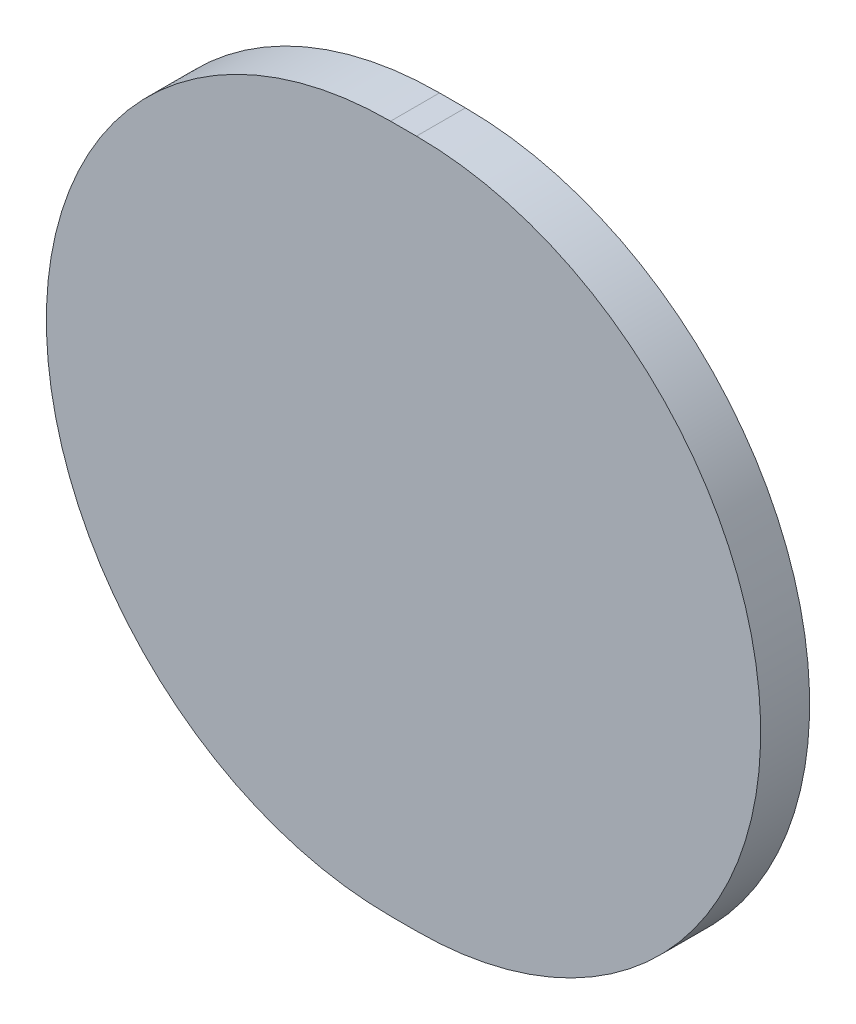
ISO-10303-21;
HEADER;
FILE_DESCRIPTION(('STEP AP214'),'2;1');
FILE_NAME('part.step','',(''),(''),'','','');
FILE_SCHEMA(('AUTOMOTIVE_DESIGN { 1 0 10303 214 1 1 1 1 }'));
ENDSEC;
DATA;
#1=APPLICATION_CONTEXT('core data for automotive mechanical design processes');
#2=APPLICATION_PROTOCOL_DEFINITION('international standard','automotive_design',2000,#1);
#3=PRODUCT_CONTEXT('',#1,'mechanical');
#4=PRODUCT('Part','Part','',(#3));
#5=PRODUCT_RELATED_PRODUCT_CATEGORY('part','',(#4));
#6=PRODUCT_DEFINITION_FORMATION('','',#4);
#7=PRODUCT_DEFINITION_CONTEXT('part definition',#1,'design');
#8=PRODUCT_DEFINITION('design','',#6,#7);
#9=PRODUCT_DEFINITION_SHAPE('','',#8);
#10=(LENGTH_UNIT() NAMED_UNIT(*) SI_UNIT(.MILLI.,.METRE.));
#11=(NAMED_UNIT(*) PLANE_ANGLE_UNIT() SI_UNIT($,.RADIAN.));
#12=(NAMED_UNIT(*) SI_UNIT($,.STERADIAN.) SOLID_ANGLE_UNIT());
#13=UNCERTAINTY_MEASURE_WITH_UNIT(LENGTH_MEASURE(1.E-05),#10,'distance_accuracy_value','');
#14=(GEOMETRIC_REPRESENTATION_CONTEXT(3) GLOBAL_UNCERTAINTY_ASSIGNED_CONTEXT((#13)) GLOBAL_UNIT_ASSIGNED_CONTEXT((#10,
#11,#12)) REPRESENTATION_CONTEXT('',''));
#15=CARTESIAN_POINT('',(0.,0.,0.));
#16=DIRECTION('',(0.,0.,1.));
#17=DIRECTION('',(1.,0.,0.));
#18=AXIS2_PLACEMENT_3D('',#15,#16,#17);
#19=CARTESIAN_POINT('',(79.44205092,67.34064764,0.));
#20=DIRECTION('',(0.,1.,0.));
#21=DIRECTION('',(1.,0.,0.));
#22=AXIS2_PLACEMENT_3D('',#19,#20,#21);
#23=PLANE('',#22);
#24=DIRECTION('',(1.,0.,0.));
#25=VECTOR('',#24,1.);
#26=CARTESIAN_POINT('',(79.44205092,67.34064764,0.03556));
#27=LINE('',#26,#25);
#28=CARTESIAN_POINT('',(79.44205092,67.34064764,0.03556));
#29=VERTEX_POINT('',#28);
#30=CARTESIAN_POINT('',(79.4608647,67.34064764,0.03556));
#31=VERTEX_POINT('',#30);
#32=EDGE_CURVE('E11',#29,#31,#27,.T.);
#33=ORIENTED_EDGE('',*,*,#32,.F.);
#34=DIRECTION('',(0.,0.,1.));
#35=VECTOR('',#34,1.);
#36=CARTESIAN_POINT('',(79.44205092,67.34064764,0.));
#37=LINE('',#36,#35);
#38=CARTESIAN_POINT('',(79.44205092,67.34064764,0.));
#39=VERTEX_POINT('',#38);
#40=EDGE_CURVE('E24',#39,#29,#37,.T.);
#41=ORIENTED_EDGE('',*,*,#40,.F.);
#42=DIRECTION('',(1.,0.,0.));
#43=VECTOR('',#42,1.);
#44=CARTESIAN_POINT('',(79.44205092,67.34064764,0.));
#45=LINE('',#44,#43);
#46=CARTESIAN_POINT('',(79.4608647,67.34064764,0.));
#47=VERTEX_POINT('',#46);
#48=EDGE_CURVE('E75',#39,#47,#45,.T.);
#49=ORIENTED_EDGE('',*,*,#48,.T.);
#50=DIRECTION('',(0.,0.,1.));
#51=VECTOR('',#50,1.);
#52=CARTESIAN_POINT('',(79.4608647,67.34064764,0.));
#53=LINE('',#52,#51);
#54=EDGE_CURVE('E37',#47,#31,#53,.T.);
#55=ORIENTED_EDGE('',*,*,#54,.T.);
#56=EDGE_LOOP('',(#33,#41,#49,#55));
#57=FACE_BOUND('',#56,.T.);
#58=ADVANCED_FACE('F17',(#57),#23,.F.);
#59=CARTESIAN_POINT('',(79.4608647,67.59064714,0.));
#60=DIRECTION('',(0.,0.,-1.));
#61=DIRECTION('',(0.,-1.,0.));
#62=AXIS2_PLACEMENT_3D('',#59,#60,#61);
#63=CYLINDRICAL_SURFACE('',#62,0.249999500000001);
#64=CARTESIAN_POINT('',(79.4608647,67.59064714,0.03556));
#65=DIRECTION('',(0.,0.,1.));
#66=DIRECTION('',(0.,-1.,0.));
#67=AXIS2_PLACEMENT_3D('',#64,#65,#66);
#68=CIRCLE('',#67,0.249999500000001);
#69=CARTESIAN_POINT('',(79.4608647,67.84064664,0.03556));
#70=VERTEX_POINT('',#69);
#71=EDGE_CURVE('E83',#31,#70,#68,.T.);
#72=ORIENTED_EDGE('',*,*,#71,.F.);
#73=ORIENTED_EDGE('',*,*,#54,.F.);
#74=CARTESIAN_POINT('',(79.4608647,67.59064714,0.));
#75=DIRECTION('',(0.,0.,1.));
#76=DIRECTION('',(0.,-1.,0.));
#77=AXIS2_PLACEMENT_3D('',#74,#75,#76);
#78=CIRCLE('',#77,0.249999500000001);
#79=CARTESIAN_POINT('',(79.4608647,67.84064664,0.));
#80=VERTEX_POINT('',#79);
#81=EDGE_CURVE('E81',#47,#80,#78,.T.);
#82=ORIENTED_EDGE('',*,*,#81,.T.);
#83=DIRECTION('',(0.,0.,1.));
#84=VECTOR('',#83,1.);
#85=CARTESIAN_POINT('',(79.4608647,67.84064664,0.));
#86=LINE('',#85,#84);
#87=EDGE_CURVE('E67',#80,#70,#86,.T.);
#88=ORIENTED_EDGE('',*,*,#87,.T.);
#89=EDGE_LOOP('',(#72,#73,#82,#88));
#90=FACE_BOUND('',#89,.T.);
#91=ADVANCED_FACE('F89',(#90),#63,.T.);
#92=CARTESIAN_POINT('',(79.4608647,67.84064664,0.));
#93=DIRECTION('',(0.,-1.,0.));
#94=DIRECTION('',(-1.,0.,0.));
#95=AXIS2_PLACEMENT_3D('',#92,#93,#94);
#96=PLANE('',#95);
#97=DIRECTION('',(-1.,0.,0.));
#98=VECTOR('',#97,1.);
#99=CARTESIAN_POINT('',(79.4608647,67.84064664,0.03556));
#100=LINE('',#99,#98);
#101=CARTESIAN_POINT('',(79.44205092,67.84064664,0.03556));
#102=VERTEX_POINT('',#101);
#103=EDGE_CURVE('E71',#70,#102,#100,.T.);
#104=ORIENTED_EDGE('',*,*,#103,.F.);
#105=ORIENTED_EDGE('',*,*,#87,.F.);
#106=DIRECTION('',(-1.,0.,0.));
#107=VECTOR('',#106,1.);
#108=CARTESIAN_POINT('',(79.4608647,67.84064664,0.));
#109=LINE('',#108,#107);
#110=CARTESIAN_POINT('',(79.44205092,67.84064664,0.));
#111=VERTEX_POINT('',#110);
#112=EDGE_CURVE('E63',#80,#111,#109,.T.);
#113=ORIENTED_EDGE('',*,*,#112,.T.);
#114=DIRECTION('',(0.,0.,1.));
#115=VECTOR('',#114,1.);
#116=CARTESIAN_POINT('',(79.44205092,67.84064664,0.));
#117=LINE('',#116,#115);
#118=EDGE_CURVE('E53',#111,#102,#117,.T.);
#119=ORIENTED_EDGE('',*,*,#118,.T.);
#120=EDGE_LOOP('',(#104,#105,#113,#119));
#121=FACE_BOUND('',#120,.T.);
#122=ADVANCED_FACE('F66',(#121),#96,.F.);
#123=CARTESIAN_POINT('',(79.44205092,67.59064714,0.));
#124=DIRECTION('',(0.,0.,-1.));
#125=DIRECTION('',(0.,1.,0.));
#126=AXIS2_PLACEMENT_3D('',#123,#124,#125);
#127=CYLINDRICAL_SURFACE('',#126,0.249999500000001);
#128=CARTESIAN_POINT('',(79.44205092,67.59064714,0.03556));
#129=DIRECTION('',(0.,0.,1.));
#130=DIRECTION('',(0.,1.,0.));
#131=AXIS2_PLACEMENT_3D('',#128,#129,#130);
#132=CIRCLE('',#131,0.249999500000001);
#133=EDGE_CURVE('E59',#102,#29,#132,.T.);
#134=ORIENTED_EDGE('',*,*,#133,.F.);
#135=ORIENTED_EDGE('',*,*,#118,.F.);
#136=CARTESIAN_POINT('',(79.44205092,67.59064714,0.));
#137=DIRECTION('',(0.,0.,1.));
#138=DIRECTION('',(0.,1.,0.));
#139=AXIS2_PLACEMENT_3D('',#136,#137,#138);
#140=CIRCLE('',#139,0.249999500000001);
#141=EDGE_CURVE('E57',#111,#39,#140,.T.);
#142=ORIENTED_EDGE('',*,*,#141,.T.);
#143=ORIENTED_EDGE('',*,*,#40,.T.);
#144=EDGE_LOOP('',(#134,#135,#142,#143));
#145=FACE_BOUND('',#144,.T.);
#146=ADVANCED_FACE('F55',(#145),#127,.T.);
#147=CARTESIAN_POINT('',(79.44205092,67.34064764,0.));
#148=DIRECTION('',(0.,0.,-1.));
#149=DIRECTION('',(-1.,0.,0.));
#150=AXIS2_PLACEMENT_3D('',#147,#148,#149);
#151=PLANE('',#150);
#152=ORIENTED_EDGE('',*,*,#141,.F.);
#153=ORIENTED_EDGE('',*,*,#112,.F.);
#154=ORIENTED_EDGE('',*,*,#81,.F.);
#155=ORIENTED_EDGE('',*,*,#48,.F.);
#156=EDGE_LOOP('',(#152,#153,#154,#155));
#157=FACE_BOUND('',#156,.T.);
#158=ADVANCED_FACE('F74',(#157),#151,.T.);
#159=CARTESIAN_POINT('',(79.44205092,67.34064764,0.03556));
#160=DIRECTION('',(0.,0.,-1.));
#161=DIRECTION('',(-1.,0.,0.));
#162=AXIS2_PLACEMENT_3D('',#159,#160,#161);
#163=PLANE('',#162);
#164=ORIENTED_EDGE('',*,*,#32,.T.);
#165=ORIENTED_EDGE('',*,*,#71,.T.);
#166=ORIENTED_EDGE('',*,*,#103,.T.);
#167=ORIENTED_EDGE('',*,*,#133,.T.);
#168=EDGE_LOOP('',(#164,#165,#166,#167));
#169=FACE_BOUND('',#168,.T.);
#170=ADVANCED_FACE('F91',(#169),#163,.F.);
#171=CLOSED_SHELL('',(#58,#91,#122,#146,#158,#170));
#172=MANIFOLD_SOLID_BREP('B1',#171);
#173=ADVANCED_BREP_SHAPE_REPRESENTATION('',(#18,#172),#14);
#174=SHAPE_DEFINITION_REPRESENTATION(#9,#173);
ENDSEC;
END-ISO-10303-21;
